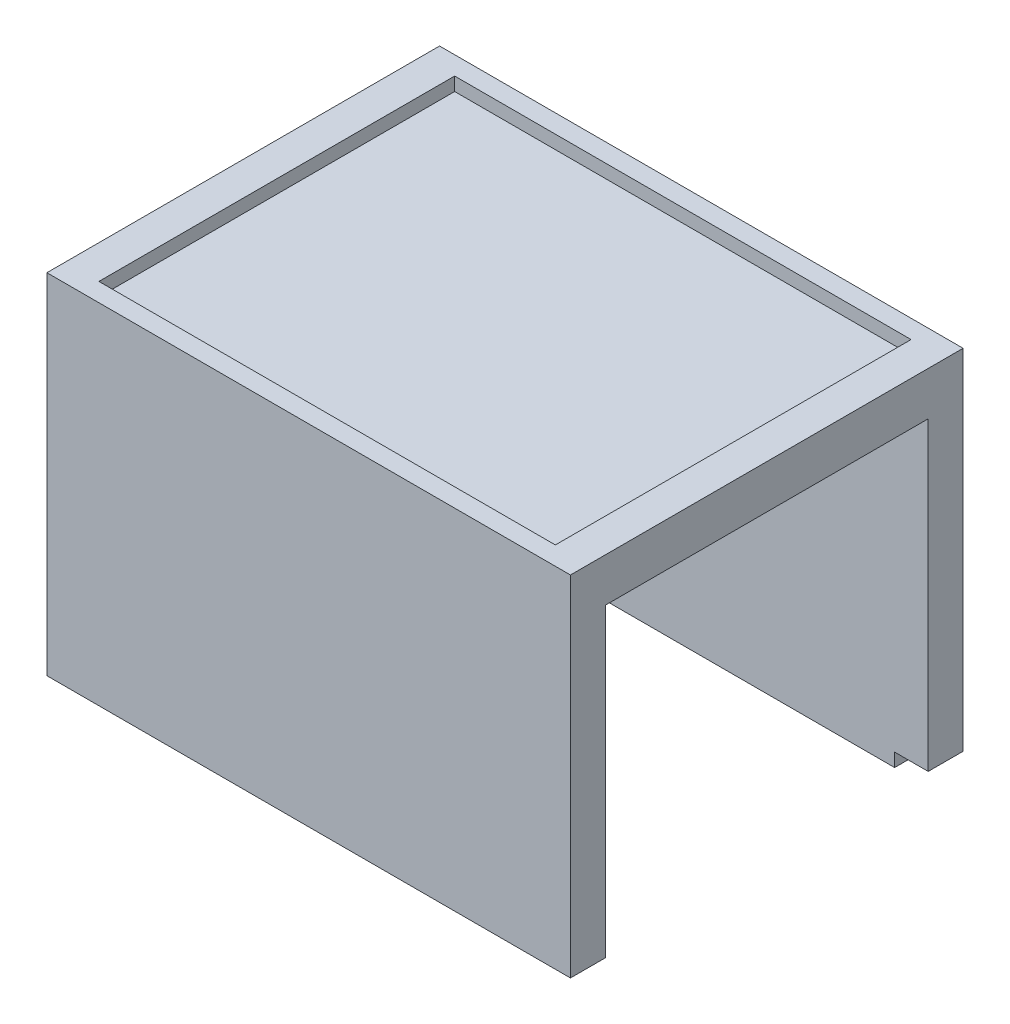
ISO-10303-21;
HEADER;
FILE_DESCRIPTION(('STEP AP214'),'2;1');
FILE_NAME('part.step','',(''),(''),'','','');
FILE_SCHEMA(('AUTOMOTIVE_DESIGN { 1 0 10303 214 1 1 1 1 }'));
ENDSEC;
DATA;
#1=APPLICATION_CONTEXT('core data for automotive mechanical design processes');
#2=APPLICATION_PROTOCOL_DEFINITION('international standard','automotive_design',2000,#1);
#3=PRODUCT_CONTEXT('',#1,'mechanical');
#4=PRODUCT('Part','Part','',(#3));
#5=PRODUCT_RELATED_PRODUCT_CATEGORY('part','',(#4));
#6=PRODUCT_DEFINITION_FORMATION('','',#4);
#7=PRODUCT_DEFINITION_CONTEXT('part definition',#1,'design');
#8=PRODUCT_DEFINITION('design','',#6,#7);
#9=PRODUCT_DEFINITION_SHAPE('','',#8);
#10=(LENGTH_UNIT() NAMED_UNIT(*) SI_UNIT(.MILLI.,.METRE.));
#11=(NAMED_UNIT(*) PLANE_ANGLE_UNIT() SI_UNIT($,.RADIAN.));
#12=(NAMED_UNIT(*) SI_UNIT($,.STERADIAN.) SOLID_ANGLE_UNIT());
#13=UNCERTAINTY_MEASURE_WITH_UNIT(LENGTH_MEASURE(1.E-05),#10,'distance_accuracy_value','');
#14=(GEOMETRIC_REPRESENTATION_CONTEXT(3) GLOBAL_UNCERTAINTY_ASSIGNED_CONTEXT((#13)) GLOBAL_UNIT_ASSIGNED_CONTEXT((#10,
#11,#12)) REPRESENTATION_CONTEXT('',''));
#15=CARTESIAN_POINT('',(0.,0.,0.));
#16=DIRECTION('',(0.,0.,1.));
#17=DIRECTION('',(1.,0.,0.));
#18=AXIS2_PLACEMENT_3D('',#15,#16,#17);
#19=CARTESIAN_POINT('',(0.,0.,0.));
#20=DIRECTION('',(0.,1.,0.));
#21=DIRECTION('',(0.,0.,1.));
#22=AXIS2_PLACEMENT_3D('',#19,#20,#21);
#23=PLANE('',#22);
#24=DIRECTION('',(-1.,0.,0.));
#25=VECTOR('',#24,1.);
#26=CARTESIAN_POINT('',(-19.5,0.,-12.025));
#27=LINE('',#26,#25);
#28=CARTESIAN_POINT('',(19.5,0.,-12.025));
#29=VERTEX_POINT('',#28);
#30=CARTESIAN_POINT('',(-19.5,0.,-12.025));
#31=VERTEX_POINT('',#30);
#32=EDGE_CURVE('E240',#29,#31,#27,.T.);
#33=ORIENTED_EDGE('',*,*,#32,.F.);
#34=DIRECTION('',(0.,0.,-1.));
#35=VECTOR('',#34,1.);
#36=CARTESIAN_POINT('',(19.5,0.,-14.625));
#37=LINE('',#36,#35);
#38=CARTESIAN_POINT('',(19.5,0.,12.025));
#39=VERTEX_POINT('',#38);
#40=EDGE_CURVE('E360',#39,#29,#37,.T.);
#41=ORIENTED_EDGE('',*,*,#40,.F.);
#42=DIRECTION('',(-1.,0.,0.));
#43=VECTOR('',#42,1.);
#44=CARTESIAN_POINT('',(-19.5,0.,12.025));
#45=LINE('',#44,#43);
#46=CARTESIAN_POINT('',(-19.5,0.,12.025));
#47=VERTEX_POINT('',#46);
#48=EDGE_CURVE('E297',#39,#47,#45,.T.);
#49=ORIENTED_EDGE('',*,*,#48,.T.);
#50=DIRECTION('',(0.,0.,1.));
#51=VECTOR('',#50,1.);
#52=CARTESIAN_POINT('',(-19.5,0.,-14.625));
#53=LINE('',#52,#51);
#54=EDGE_CURVE('E370',#31,#47,#53,.T.);
#55=ORIENTED_EDGE('',*,*,#54,.F.);
#56=EDGE_LOOP('',(#33,#41,#49,#55));
#57=FACE_BOUND('',#56,.T.);
#58=ADVANCED_FACE('F45',(#57),#23,.F.);
#59=CARTESIAN_POINT('',(0.,3.25,0.));
#60=DIRECTION('',(0.,1.,0.));
#61=DIRECTION('',(0.,0.,1.));
#62=AXIS2_PLACEMENT_3D('',#59,#60,#61);
#63=PLANE('',#62);
#64=DIRECTION('',(0.,0.,-1.));
#65=VECTOR('',#64,1.);
#66=CARTESIAN_POINT('',(19.5,3.25,-14.625));
#67=LINE('',#66,#65);
#68=CARTESIAN_POINT('',(19.5,3.25,14.625));
#69=VERTEX_POINT('',#68);
#70=CARTESIAN_POINT('',(19.5,3.25,-14.625));
#71=VERTEX_POINT('',#70);
#72=EDGE_CURVE('E365',#69,#71,#67,.T.);
#73=ORIENTED_EDGE('',*,*,#72,.T.);
#74=DIRECTION('',(-1.,0.,0.));
#75=VECTOR('',#74,1.);
#76=CARTESIAN_POINT('',(-19.5,3.25,-14.625));
#77=LINE('',#76,#75);
#78=CARTESIAN_POINT('',(-19.5,3.25,-14.625));
#79=VERTEX_POINT('',#78);
#80=EDGE_CURVE('E369',#71,#79,#77,.T.);
#81=ORIENTED_EDGE('',*,*,#80,.T.);
#82=DIRECTION('',(0.,0.,1.));
#83=VECTOR('',#82,1.);
#84=CARTESIAN_POINT('',(-19.5,3.25,-14.625));
#85=LINE('',#84,#83);
#86=CARTESIAN_POINT('',(-19.5,3.25,14.625));
#87=VERTEX_POINT('',#86);
#88=EDGE_CURVE('E373',#79,#87,#85,.T.);
#89=ORIENTED_EDGE('',*,*,#88,.T.);
#90=DIRECTION('',(1.,0.,0.));
#91=VECTOR('',#90,1.);
#92=CARTESIAN_POINT('',(-19.5,3.25,14.625));
#93=LINE('',#92,#91);
#94=EDGE_CURVE('E376',#87,#69,#93,.T.);
#95=ORIENTED_EDGE('',*,*,#94,.T.);
#96=EDGE_LOOP('',(#73,#81,#89,#95));
#97=FACE_BOUND('',#96,.T.);
#98=DIRECTION('',(1.,0.,0.));
#99=VECTOR('',#98,1.);
#100=CARTESIAN_POINT('',(-17.,3.25,-13.25));
#101=LINE('',#100,#99);
#102=CARTESIAN_POINT('',(-17.,3.25,-13.25));
#103=VERTEX_POINT('',#102);
#104=CARTESIAN_POINT('',(17.,3.25,-13.25));
#105=VERTEX_POINT('',#104);
#106=EDGE_CURVE('E317',#103,#105,#101,.T.);
#107=ORIENTED_EDGE('',*,*,#106,.T.);
#108=DIRECTION('',(0.,0.,-1.));
#109=VECTOR('',#108,1.);
#110=CARTESIAN_POINT('',(17.,3.25,-12.));
#111=LINE('',#110,#109);
#112=CARTESIAN_POINT('',(17.,3.25,13.25));
#113=VERTEX_POINT('',#112);
#114=EDGE_CURVE('E349',#113,#105,#111,.T.);
#115=ORIENTED_EDGE('',*,*,#114,.F.);
#116=DIRECTION('',(1.,0.,0.));
#117=VECTOR('',#116,1.);
#118=CARTESIAN_POINT('',(-17.,3.25,13.25));
#119=LINE('',#118,#117);
#120=CARTESIAN_POINT('',(-17.,3.25,13.25));
#121=VERTEX_POINT('',#120);
#122=EDGE_CURVE('E333',#121,#113,#119,.T.);
#123=ORIENTED_EDGE('',*,*,#122,.F.);
#124=DIRECTION('',(0.,0.,1.));
#125=VECTOR('',#124,1.);
#126=CARTESIAN_POINT('',(-17.,3.25,-12.));
#127=LINE('',#126,#125);
#128=EDGE_CURVE('E357',#103,#121,#127,.T.);
#129=ORIENTED_EDGE('',*,*,#128,.F.);
#130=EDGE_LOOP('',(#107,#115,#123,#129));
#131=FACE_BOUND('',#130,.T.);
#132=ADVANCED_FACE('F448',(#97,#131),#63,.T.);
#133=CARTESIAN_POINT('',(19.5,3.25,-14.625));
#134=DIRECTION('',(-1.,0.,0.));
#135=DIRECTION('',(0.,0.,1.));
#136=AXIS2_PLACEMENT_3D('',#133,#134,#135);
#137=PLANE('',#136);
#138=DIRECTION('',(0.,-1.,0.));
#139=VECTOR('',#138,1.);
#140=CARTESIAN_POINT('',(19.5,3.25,14.625));
#141=LINE('',#140,#139);
#142=CARTESIAN_POINT('',(19.5,-22.75,14.625));
#143=VERTEX_POINT('',#142);
#144=EDGE_CURVE('E379',#69,#143,#141,.T.);
#145=ORIENTED_EDGE('',*,*,#144,.T.);
#146=DIRECTION('',(0.,0.,1.));
#147=VECTOR('',#146,1.);
#148=CARTESIAN_POINT('',(19.5,-22.75,12.025));
#149=LINE('',#148,#147);
#150=CARTESIAN_POINT('',(19.5,-22.75,12.025));
#151=VERTEX_POINT('',#150);
#152=EDGE_CURVE('E313',#151,#143,#149,.T.);
#153=ORIENTED_EDGE('',*,*,#152,.F.);
#154=DIRECTION('',(0.,1.,0.));
#155=VECTOR('',#154,1.);
#156=CARTESIAN_POINT('',(19.5,0.,12.025));
#157=LINE('',#156,#155);
#158=EDGE_CURVE('E293',#151,#39,#157,.T.);
#159=ORIENTED_EDGE('',*,*,#158,.T.);
#160=ORIENTED_EDGE('',*,*,#40,.T.);
#161=DIRECTION('',(0.,1.,0.));
#162=VECTOR('',#161,1.);
#163=CARTESIAN_POINT('',(19.5,0.,-12.025));
#164=LINE('',#163,#162);
#165=CARTESIAN_POINT('',(19.5,-22.75,-12.025));
#166=VERTEX_POINT('',#165);
#167=EDGE_CURVE('E230',#166,#29,#164,.T.);
#168=ORIENTED_EDGE('',*,*,#167,.F.);
#169=DIRECTION('',(0.,0.,-1.));
#170=VECTOR('',#169,1.);
#171=CARTESIAN_POINT('',(19.5,-22.75,-12.025));
#172=LINE('',#171,#170);
#173=CARTESIAN_POINT('',(19.5,-22.75,-14.625));
#174=VERTEX_POINT('',#173);
#175=EDGE_CURVE('E243',#166,#174,#172,.T.);
#176=ORIENTED_EDGE('',*,*,#175,.T.);
#177=DIRECTION('',(0.,-1.,0.));
#178=VECTOR('',#177,1.);
#179=CARTESIAN_POINT('',(19.5,3.25,-14.625));
#180=LINE('',#179,#178);
#181=EDGE_CURVE('E11',#71,#174,#180,.T.);
#182=ORIENTED_EDGE('',*,*,#181,.F.);
#183=ORIENTED_EDGE('',*,*,#72,.F.);
#184=EDGE_LOOP('',(#145,#153,#159,#160,#168,#176,#182,#183));
#185=FACE_BOUND('',#184,.T.);
#186=ADVANCED_FACE('F47',(#185),#137,.F.);
#187=CARTESIAN_POINT('',(-19.5,3.25,-14.625));
#188=DIRECTION('',(0.,0.,1.));
#189=DIRECTION('',(1.,0.,0.));
#190=AXIS2_PLACEMENT_3D('',#187,#188,#189);
#191=PLANE('',#190);
#192=ORIENTED_EDGE('',*,*,#181,.T.);
#193=DIRECTION('',(1.,0.,0.));
#194=VECTOR('',#193,1.);
#195=CARTESIAN_POINT('',(-19.5,-22.75,-14.625));
#196=LINE('',#195,#194);
#197=CARTESIAN_POINT('',(-19.5,-22.75,-14.625));
#198=VERTEX_POINT('',#197);
#199=EDGE_CURVE('E189',#198,#174,#196,.T.);
#200=ORIENTED_EDGE('',*,*,#199,.F.);
#201=DIRECTION('',(0.,-1.,0.));
#202=VECTOR('',#201,1.);
#203=CARTESIAN_POINT('',(-19.5,3.25,-14.625));
#204=LINE('',#203,#202);
#205=EDGE_CURVE('E54',#79,#198,#204,.T.);
#206=ORIENTED_EDGE('',*,*,#205,.F.);
#207=ORIENTED_EDGE('',*,*,#80,.F.);
#208=EDGE_LOOP('',(#192,#200,#206,#207));
#209=FACE_BOUND('',#208,.T.);
#210=ADVANCED_FACE('F403',(#209),#191,.F.);
#211=CARTESIAN_POINT('',(-19.5,3.25,-14.625));
#212=DIRECTION('',(1.,0.,0.));
#213=DIRECTION('',(0.,0.,-1.));
#214=AXIS2_PLACEMENT_3D('',#211,#212,#213);
#215=PLANE('',#214);
#216=ORIENTED_EDGE('',*,*,#205,.T.);
#217=DIRECTION('',(0.,0.,-1.));
#218=VECTOR('',#217,1.);
#219=CARTESIAN_POINT('',(-19.5,-22.75,-12.025));
#220=LINE('',#219,#218);
#221=CARTESIAN_POINT('',(-19.5,-22.75,-12.025));
#222=VERTEX_POINT('',#221);
#223=EDGE_CURVE('E247',#222,#198,#220,.T.);
#224=ORIENTED_EDGE('',*,*,#223,.F.);
#225=DIRECTION('',(0.,-1.,0.));
#226=VECTOR('',#225,1.);
#227=CARTESIAN_POINT('',(-19.5,0.,-12.025));
#228=LINE('',#227,#226);
#229=EDGE_CURVE('E237',#31,#222,#228,.T.);
#230=ORIENTED_EDGE('',*,*,#229,.F.);
#231=ORIENTED_EDGE('',*,*,#54,.T.);
#232=DIRECTION('',(0.,-1.,0.));
#233=VECTOR('',#232,1.);
#234=CARTESIAN_POINT('',(-19.5,0.,12.025));
#235=LINE('',#234,#233);
#236=CARTESIAN_POINT('',(-19.5,-22.75,12.025));
#237=VERTEX_POINT('',#236);
#238=EDGE_CURVE('E301',#47,#237,#235,.T.);
#239=ORIENTED_EDGE('',*,*,#238,.T.);
#240=DIRECTION('',(0.,0.,1.));
#241=VECTOR('',#240,1.);
#242=CARTESIAN_POINT('',(-19.5,-22.75,12.025));
#243=LINE('',#242,#241);
#244=CARTESIAN_POINT('',(-19.5,-22.75,14.625));
#245=VERTEX_POINT('',#244);
#246=EDGE_CURVE('E309',#237,#245,#243,.T.);
#247=ORIENTED_EDGE('',*,*,#246,.T.);
#248=DIRECTION('',(0.,-1.,0.));
#249=VECTOR('',#248,1.);
#250=CARTESIAN_POINT('',(-19.5,3.25,14.625));
#251=LINE('',#250,#249);
#252=EDGE_CURVE('E387',#87,#245,#251,.T.);
#253=ORIENTED_EDGE('',*,*,#252,.F.);
#254=ORIENTED_EDGE('',*,*,#88,.F.);
#255=EDGE_LOOP('',(#216,#224,#230,#231,#239,#247,#253,#254));
#256=FACE_BOUND('',#255,.T.);
#257=ADVANCED_FACE('F394',(#256),#215,.F.);
#258=CARTESIAN_POINT('',(-19.5,3.25,14.625));
#259=DIRECTION('',(0.,0.,-1.));
#260=DIRECTION('',(-1.,0.,0.));
#261=AXIS2_PLACEMENT_3D('',#258,#259,#260);
#262=PLANE('',#261);
#263=ORIENTED_EDGE('',*,*,#252,.T.);
#264=DIRECTION('',(1.,0.,0.));
#265=VECTOR('',#264,1.);
#266=CARTESIAN_POINT('',(-19.5,-22.75,14.625));
#267=LINE('',#266,#265);
#268=EDGE_CURVE('E292',#245,#143,#267,.T.);
#269=ORIENTED_EDGE('',*,*,#268,.T.);
#270=ORIENTED_EDGE('',*,*,#144,.F.);
#271=ORIENTED_EDGE('',*,*,#94,.F.);
#272=EDGE_LOOP('',(#263,#269,#270,#271));
#273=FACE_BOUND('',#272,.T.);
#274=ADVANCED_FACE('F458',(#273),#262,.F.);
#275=CARTESIAN_POINT('',(17.,2.25,-12.));
#276=DIRECTION('',(1.,0.,0.));
#277=DIRECTION('',(0.,0.,-1.));
#278=AXIS2_PLACEMENT_3D('',#275,#276,#277);
#279=PLANE('',#278);
#280=ORIENTED_EDGE('',*,*,#114,.T.);
#281=DIRECTION('',(0.,1.,0.));
#282=VECTOR('',#281,1.);
#283=CARTESIAN_POINT('',(17.,2.25,-13.25));
#284=LINE('',#283,#282);
#285=CARTESIAN_POINT('',(17.,2.25,-13.25));
#286=VERTEX_POINT('',#285);
#287=EDGE_CURVE('E325',#286,#105,#284,.T.);
#288=ORIENTED_EDGE('',*,*,#287,.F.);
#289=DIRECTION('',(0.,0.,-1.));
#290=VECTOR('',#289,1.);
#291=CARTESIAN_POINT('',(17.,2.25,-12.));
#292=LINE('',#291,#290);
#293=CARTESIAN_POINT('',(17.,2.25,13.25));
#294=VERTEX_POINT('',#293);
#295=EDGE_CURVE('E353',#294,#286,#292,.T.);
#296=ORIENTED_EDGE('',*,*,#295,.F.);
#297=DIRECTION('',(0.,1.,0.));
#298=VECTOR('',#297,1.);
#299=CARTESIAN_POINT('',(17.,2.25,13.25));
#300=LINE('',#299,#298);
#301=EDGE_CURVE('E345',#294,#113,#300,.T.);
#302=ORIENTED_EDGE('',*,*,#301,.T.);
#303=EDGE_LOOP('',(#280,#288,#296,#302));
#304=FACE_BOUND('',#303,.T.);
#305=ADVANCED_FACE('F461',(#304),#279,.F.);
#306=CARTESIAN_POINT('',(-17.,2.25,-12.));
#307=DIRECTION('',(-1.,0.,0.));
#308=DIRECTION('',(0.,0.,1.));
#309=AXIS2_PLACEMENT_3D('',#306,#307,#308);
#310=PLANE('',#309);
#311=ORIENTED_EDGE('',*,*,#128,.T.);
#312=DIRECTION('',(0.,1.,0.));
#313=VECTOR('',#312,1.);
#314=CARTESIAN_POINT('',(-17.,2.25,13.25));
#315=LINE('',#314,#313);
#316=CARTESIAN_POINT('',(-17.,2.25,13.25));
#317=VERTEX_POINT('',#316);
#318=EDGE_CURVE('E341',#317,#121,#315,.T.);
#319=ORIENTED_EDGE('',*,*,#318,.F.);
#320=DIRECTION('',(0.,0.,1.));
#321=VECTOR('',#320,1.);
#322=CARTESIAN_POINT('',(-17.,2.25,-12.));
#323=LINE('',#322,#321);
#324=CARTESIAN_POINT('',(-17.,2.25,-13.25));
#325=VERTEX_POINT('',#324);
#326=EDGE_CURVE('E356',#325,#317,#323,.T.);
#327=ORIENTED_EDGE('',*,*,#326,.F.);
#328=DIRECTION('',(0.,1.,0.));
#329=VECTOR('',#328,1.);
#330=CARTESIAN_POINT('',(-17.,2.25,-13.25));
#331=LINE('',#330,#329);
#332=EDGE_CURVE('E329',#325,#103,#331,.T.);
#333=ORIENTED_EDGE('',*,*,#332,.T.);
#334=EDGE_LOOP('',(#311,#319,#327,#333));
#335=FACE_BOUND('',#334,.T.);
#336=ADVANCED_FACE('F621',(#335),#310,.F.);
#337=CARTESIAN_POINT('',(0.,2.25,0.));
#338=DIRECTION('',(0.,1.,0.));
#339=DIRECTION('',(0.,0.,1.));
#340=AXIS2_PLACEMENT_3D('',#337,#338,#339);
#341=PLANE('',#340);
#342=ORIENTED_EDGE('',*,*,#295,.T.);
#343=DIRECTION('',(1.,0.,0.));
#344=VECTOR('',#343,1.);
#345=CARTESIAN_POINT('',(-17.,2.25,-13.25));
#346=LINE('',#345,#344);
#347=EDGE_CURVE('E321',#325,#286,#346,.T.);
#348=ORIENTED_EDGE('',*,*,#347,.F.);
#349=ORIENTED_EDGE('',*,*,#326,.T.);
#350=DIRECTION('',(1.,0.,0.));
#351=VECTOR('',#350,1.);
#352=CARTESIAN_POINT('',(-17.,2.25,13.25));
#353=LINE('',#352,#351);
#354=EDGE_CURVE('E337',#317,#294,#353,.T.);
#355=ORIENTED_EDGE('',*,*,#354,.T.);
#356=EDGE_LOOP('',(#342,#348,#349,#355));
#357=FACE_BOUND('',#356,.T.);
#358=ADVANCED_FACE('F611',(#357),#341,.T.);
#359=CARTESIAN_POINT('',(-17.,2.25,13.25));
#360=DIRECTION('',(0.,0.,1.));
#361=DIRECTION('',(1.,0.,0.));
#362=AXIS2_PLACEMENT_3D('',#359,#360,#361);
#363=PLANE('',#362);
#364=ORIENTED_EDGE('',*,*,#122,.T.);
#365=ORIENTED_EDGE('',*,*,#301,.F.);
#366=ORIENTED_EDGE('',*,*,#354,.F.);
#367=ORIENTED_EDGE('',*,*,#318,.T.);
#368=EDGE_LOOP('',(#364,#365,#366,#367));
#369=FACE_BOUND('',#368,.T.);
#370=ADVANCED_FACE('F593',(#369),#363,.F.);
#371=CARTESIAN_POINT('',(-17.,2.25,-13.25));
#372=DIRECTION('',(0.,0.,1.));
#373=DIRECTION('',(1.,0.,0.));
#374=AXIS2_PLACEMENT_3D('',#371,#372,#373);
#375=PLANE('',#374);
#376=ORIENTED_EDGE('',*,*,#106,.F.);
#377=ORIENTED_EDGE('',*,*,#332,.F.);
#378=ORIENTED_EDGE('',*,*,#347,.T.);
#379=ORIENTED_EDGE('',*,*,#287,.T.);
#380=EDGE_LOOP('',(#376,#377,#378,#379));
#381=FACE_BOUND('',#380,.T.);
#382=ADVANCED_FACE('F586',(#381),#375,.T.);
#383=CARTESIAN_POINT('',(-19.5,-22.75,12.025));
#384=DIRECTION('',(0.,-1.,0.));
#385=DIRECTION('',(0.,0.,-1.));
#386=AXIS2_PLACEMENT_3D('',#383,#384,#385);
#387=PLANE('',#386);
#388=DIRECTION('',(0.,0.,1.));
#389=VECTOR('',#388,1.);
#390=CARTESIAN_POINT('',(17.,-22.75,13.275));
#391=LINE('',#390,#389);
#392=CARTESIAN_POINT('',(17.,-22.75,12.025));
#393=VERTEX_POINT('',#392);
#394=CARTESIAN_POINT('',(17.,-22.75,13.275));
#395=VERTEX_POINT('',#394);
#396=EDGE_CURVE('E251',#393,#395,#391,.T.);
#397=ORIENTED_EDGE('',*,*,#396,.F.);
#398=DIRECTION('',(1.,0.,0.));
#399=VECTOR('',#398,1.);
#400=CARTESIAN_POINT('',(-19.5,-22.75,12.025));
#401=LINE('',#400,#399);
#402=EDGE_CURVE('E305',#393,#151,#401,.T.);
#403=ORIENTED_EDGE('',*,*,#402,.T.);
#404=ORIENTED_EDGE('',*,*,#152,.T.);
#405=ORIENTED_EDGE('',*,*,#268,.F.);
#406=ORIENTED_EDGE('',*,*,#246,.F.);
#407=CARTESIAN_POINT('',(-17.,-22.75,12.025));
#408=VERTEX_POINT('',#407);
#409=EDGE_CURVE('E306',#237,#408,#401,.T.);
#410=ORIENTED_EDGE('',*,*,#409,.T.);
#411=DIRECTION('',(0.,0.,-1.));
#412=VECTOR('',#411,1.);
#413=CARTESIAN_POINT('',(-17.,-22.75,13.275));
#414=LINE('',#413,#412);
#415=CARTESIAN_POINT('',(-17.,-22.75,13.275));
#416=VERTEX_POINT('',#415);
#417=EDGE_CURVE('E260',#416,#408,#414,.T.);
#418=ORIENTED_EDGE('',*,*,#417,.F.);
#419=DIRECTION('',(-1.,0.,0.));
#420=VECTOR('',#419,1.);
#421=CARTESIAN_POINT('',(-17.,-22.75,13.275));
#422=LINE('',#421,#420);
#423=EDGE_CURVE('E69',#395,#416,#422,.T.);
#424=ORIENTED_EDGE('',*,*,#423,.F.);
#425=EDGE_LOOP('',(#397,#403,#404,#405,#406,#410,#418,#424));
#426=FACE_BOUND('',#425,.T.);
#427=ADVANCED_FACE('F412',(#426),#387,.T.);
#428=CARTESIAN_POINT('',(0.,0.,12.025));
#429=DIRECTION('',(0.,0.,1.));
#430=DIRECTION('',(1.,0.,0.));
#431=AXIS2_PLACEMENT_3D('',#428,#429,#430);
#432=PLANE('',#431);
#433=ORIENTED_EDGE('',*,*,#158,.F.);
#434=ORIENTED_EDGE('',*,*,#402,.F.);
#435=DIRECTION('',(0.,1.,0.));
#436=VECTOR('',#435,1.);
#437=CARTESIAN_POINT('',(17.,-23.75,12.025));
#438=LINE('',#437,#436);
#439=CARTESIAN_POINT('',(17.,-23.75,12.025));
#440=VERTEX_POINT('',#439);
#441=EDGE_CURVE('E269',#440,#393,#438,.T.);
#442=ORIENTED_EDGE('',*,*,#441,.F.);
#443=DIRECTION('',(1.,0.,0.));
#444=VECTOR('',#443,1.);
#445=CARTESIAN_POINT('',(-17.,-23.75,12.025));
#446=LINE('',#445,#444);
#447=CARTESIAN_POINT('',(-17.,-23.75,12.025));
#448=VERTEX_POINT('',#447);
#449=EDGE_CURVE('E266',#448,#440,#446,.T.);
#450=ORIENTED_EDGE('',*,*,#449,.F.);
#451=DIRECTION('',(0.,1.,0.));
#452=VECTOR('',#451,1.);
#453=CARTESIAN_POINT('',(-17.,-23.75,12.025));
#454=LINE('',#453,#452);
#455=EDGE_CURVE('E281',#448,#408,#454,.T.);
#456=ORIENTED_EDGE('',*,*,#455,.T.);
#457=ORIENTED_EDGE('',*,*,#409,.F.);
#458=ORIENTED_EDGE('',*,*,#238,.F.);
#459=ORIENTED_EDGE('',*,*,#48,.F.);
#460=EDGE_LOOP('',(#433,#434,#442,#450,#456,#457,#458,#459));
#461=FACE_BOUND('',#460,.T.);
#462=ADVANCED_FACE('F419',(#461),#432,.F.);
#463=CARTESIAN_POINT('',(17.,-23.75,13.275));
#464=DIRECTION('',(-1.,0.,0.));
#465=DIRECTION('',(0.,0.,1.));
#466=AXIS2_PLACEMENT_3D('',#463,#464,#465);
#467=PLANE('',#466);
#468=ORIENTED_EDGE('',*,*,#396,.T.);
#469=DIRECTION('',(0.,1.,0.));
#470=VECTOR('',#469,1.);
#471=CARTESIAN_POINT('',(17.,-23.75,13.275));
#472=LINE('',#471,#470);
#473=CARTESIAN_POINT('',(17.,-23.75,13.275));
#474=VERTEX_POINT('',#473);
#475=EDGE_CURVE('E289',#474,#395,#472,.T.);
#476=ORIENTED_EDGE('',*,*,#475,.F.);
#477=DIRECTION('',(0.,0.,1.));
#478=VECTOR('',#477,1.);
#479=CARTESIAN_POINT('',(17.,-23.75,13.275));
#480=LINE('',#479,#478);
#481=EDGE_CURVE('E255',#440,#474,#480,.T.);
#482=ORIENTED_EDGE('',*,*,#481,.F.);
#483=ORIENTED_EDGE('',*,*,#441,.T.);
#484=EDGE_LOOP('',(#468,#476,#482,#483));
#485=FACE_BOUND('',#484,.T.);
#486=ADVANCED_FACE('F436',(#485),#467,.F.);
#487=CARTESIAN_POINT('',(-17.,-23.75,13.275));
#488=DIRECTION('',(0.,0.,-1.));
#489=DIRECTION('',(-1.,0.,0.));
#490=AXIS2_PLACEMENT_3D('',#487,#488,#489);
#491=PLANE('',#490);
#492=ORIENTED_EDGE('',*,*,#423,.T.);
#493=DIRECTION('',(0.,1.,0.));
#494=VECTOR('',#493,1.);
#495=CARTESIAN_POINT('',(-17.,-23.75,13.275));
#496=LINE('',#495,#494);
#497=CARTESIAN_POINT('',(-17.,-23.75,13.275));
#498=VERTEX_POINT('',#497);
#499=EDGE_CURVE('E285',#498,#416,#496,.T.);
#500=ORIENTED_EDGE('',*,*,#499,.F.);
#501=DIRECTION('',(-1.,0.,0.));
#502=VECTOR('',#501,1.);
#503=CARTESIAN_POINT('',(-17.,-23.75,13.275));
#504=LINE('',#503,#502);
#505=EDGE_CURVE('E259',#474,#498,#504,.T.);
#506=ORIENTED_EDGE('',*,*,#505,.F.);
#507=ORIENTED_EDGE('',*,*,#475,.T.);
#508=EDGE_LOOP('',(#492,#500,#506,#507));
#509=FACE_BOUND('',#508,.T.);
#510=ADVANCED_FACE('F432',(#509),#491,.F.);
#511=CARTESIAN_POINT('',(-17.,-23.75,13.275));
#512=DIRECTION('',(1.,0.,0.));
#513=DIRECTION('',(0.,0.,-1.));
#514=AXIS2_PLACEMENT_3D('',#511,#512,#513);
#515=PLANE('',#514);
#516=ORIENTED_EDGE('',*,*,#417,.T.);
#517=ORIENTED_EDGE('',*,*,#455,.F.);
#518=DIRECTION('',(0.,0.,-1.));
#519=VECTOR('',#518,1.);
#520=CARTESIAN_POINT('',(-17.,-23.75,13.275));
#521=LINE('',#520,#519);
#522=EDGE_CURVE('E263',#498,#448,#521,.T.);
#523=ORIENTED_EDGE('',*,*,#522,.F.);
#524=ORIENTED_EDGE('',*,*,#499,.T.);
#525=EDGE_LOOP('',(#516,#517,#523,#524));
#526=FACE_BOUND('',#525,.T.);
#527=ADVANCED_FACE('F428',(#526),#515,.F.);
#528=CARTESIAN_POINT('',(0.,-23.75,0.));
#529=DIRECTION('',(0.,-1.,0.));
#530=DIRECTION('',(0.,0.,-1.));
#531=AXIS2_PLACEMENT_3D('',#528,#529,#530);
#532=PLANE('',#531);
#533=ORIENTED_EDGE('',*,*,#481,.T.);
#534=ORIENTED_EDGE('',*,*,#505,.T.);
#535=ORIENTED_EDGE('',*,*,#522,.T.);
#536=ORIENTED_EDGE('',*,*,#449,.T.);
#537=EDGE_LOOP('',(#533,#534,#535,#536));
#538=FACE_BOUND('',#537,.T.);
#539=ADVANCED_FACE('F438',(#538),#532,.T.);
#540=CARTESIAN_POINT('',(-19.5,-22.75,-12.025));
#541=DIRECTION('',(0.,1.,0.));
#542=DIRECTION('',(0.,0.,1.));
#543=AXIS2_PLACEMENT_3D('',#540,#541,#542);
#544=PLANE('',#543);
#545=DIRECTION('',(1.,0.,0.));
#546=VECTOR('',#545,1.);
#547=CARTESIAN_POINT('',(-19.5,-22.75,-12.025));
#548=LINE('',#547,#546);
#549=CARTESIAN_POINT('',(17.,-22.75,-12.025));
#550=VERTEX_POINT('',#549);
#551=EDGE_CURVE('E233',#550,#166,#548,.T.);
#552=ORIENTED_EDGE('',*,*,#551,.F.);
#553=DIRECTION('',(0.,0.,-1.));
#554=VECTOR('',#553,1.);
#555=CARTESIAN_POINT('',(17.,-22.75,-13.275));
#556=LINE('',#555,#554);
#557=CARTESIAN_POINT('',(17.,-22.75,-13.275));
#558=VERTEX_POINT('',#557);
#559=EDGE_CURVE('E61',#550,#558,#556,.T.);
#560=ORIENTED_EDGE('',*,*,#559,.T.);
#561=DIRECTION('',(-1.,0.,0.));
#562=VECTOR('',#561,1.);
#563=CARTESIAN_POINT('',(-17.,-22.75,-13.275));
#564=LINE('',#563,#562);
#565=CARTESIAN_POINT('',(-17.,-22.75,-13.275));
#566=VERTEX_POINT('',#565);
#567=EDGE_CURVE('E201',#558,#566,#564,.T.);
#568=ORIENTED_EDGE('',*,*,#567,.T.);
#569=DIRECTION('',(0.,0.,1.));
#570=VECTOR('',#569,1.);
#571=CARTESIAN_POINT('',(-17.,-22.75,-13.275));
#572=LINE('',#571,#570);
#573=CARTESIAN_POINT('',(-17.,-22.75,-12.025));
#574=VERTEX_POINT('',#573);
#575=EDGE_CURVE('E216',#566,#574,#572,.T.);
#576=ORIENTED_EDGE('',*,*,#575,.T.);
#577=EDGE_CURVE('E234',#222,#574,#548,.T.);
#578=ORIENTED_EDGE('',*,*,#577,.F.);
#579=ORIENTED_EDGE('',*,*,#223,.T.);
#580=ORIENTED_EDGE('',*,*,#199,.T.);
#581=ORIENTED_EDGE('',*,*,#175,.F.);
#582=EDGE_LOOP('',(#552,#560,#568,#576,#578,#579,#580,#581));
#583=FACE_BOUND('',#582,.T.);
#584=ADVANCED_FACE('F401',(#583),#544,.F.);
#585=CARTESIAN_POINT('',(0.,0.,-12.025));
#586=DIRECTION('',(0.,0.,-1.));
#587=DIRECTION('',(1.,0.,0.));
#588=AXIS2_PLACEMENT_3D('',#585,#586,#587);
#589=PLANE('',#588);
#590=ORIENTED_EDGE('',*,*,#167,.T.);
#591=ORIENTED_EDGE('',*,*,#32,.T.);
#592=ORIENTED_EDGE('',*,*,#229,.T.);
#593=ORIENTED_EDGE('',*,*,#577,.T.);
#594=DIRECTION('',(0.,1.,0.));
#595=VECTOR('',#594,1.);
#596=CARTESIAN_POINT('',(-17.,-23.75,-12.025));
#597=LINE('',#596,#595);
#598=CARTESIAN_POINT('',(-17.,-23.75,-12.025));
#599=VERTEX_POINT('',#598);
#600=EDGE_CURVE('E190',#599,#574,#597,.T.);
#601=ORIENTED_EDGE('',*,*,#600,.F.);
#602=DIRECTION('',(1.,0.,0.));
#603=VECTOR('',#602,1.);
#604=CARTESIAN_POINT('',(-17.,-23.75,-12.025));
#605=LINE('',#604,#603);
#606=CARTESIAN_POINT('',(17.,-23.75,-12.025));
#607=VERTEX_POINT('',#606);
#608=EDGE_CURVE('E196',#599,#607,#605,.T.);
#609=ORIENTED_EDGE('',*,*,#608,.T.);
#610=DIRECTION('',(0.,1.,0.));
#611=VECTOR('',#610,1.);
#612=CARTESIAN_POINT('',(17.,-23.75,-12.025));
#613=LINE('',#612,#611);
#614=EDGE_CURVE('E180',#607,#550,#613,.T.);
#615=ORIENTED_EDGE('',*,*,#614,.T.);
#616=ORIENTED_EDGE('',*,*,#551,.T.);
#617=EDGE_LOOP('',(#590,#591,#592,#593,#601,#609,#615,#616));
#618=FACE_BOUND('',#617,.T.);
#619=ADVANCED_FACE('F203',(#618),#589,.F.);
#620=CARTESIAN_POINT('',(17.,-23.75,-13.275));
#621=DIRECTION('',(1.,0.,0.));
#622=DIRECTION('',(0.,0.,-1.));
#623=AXIS2_PLACEMENT_3D('',#620,#621,#622);
#624=PLANE('',#623);
#625=ORIENTED_EDGE('',*,*,#559,.F.);
#626=ORIENTED_EDGE('',*,*,#614,.F.);
#627=DIRECTION('',(0.,0.,-1.));
#628=VECTOR('',#627,1.);
#629=CARTESIAN_POINT('',(17.,-23.75,-13.275));
#630=LINE('',#629,#628);
#631=CARTESIAN_POINT('',(17.,-23.75,-13.275));
#632=VERTEX_POINT('',#631);
#633=EDGE_CURVE('E183',#607,#632,#630,.T.);
#634=ORIENTED_EDGE('',*,*,#633,.T.);
#635=DIRECTION('',(0.,1.,0.));
#636=VECTOR('',#635,1.);
#637=CARTESIAN_POINT('',(17.,-23.75,-13.275));
#638=LINE('',#637,#636);
#639=EDGE_CURVE('E213',#632,#558,#638,.T.);
#640=ORIENTED_EDGE('',*,*,#639,.T.);
#641=EDGE_LOOP('',(#625,#626,#634,#640));
#642=FACE_BOUND('',#641,.T.);
#643=ADVANCED_FACE('F182',(#642),#624,.T.);
#644=CARTESIAN_POINT('',(-17.,-23.75,-13.275));
#645=DIRECTION('',(-1.,0.,0.));
#646=DIRECTION('',(0.,0.,1.));
#647=AXIS2_PLACEMENT_3D('',#644,#645,#646);
#648=PLANE('',#647);
#649=ORIENTED_EDGE('',*,*,#575,.F.);
#650=DIRECTION('',(0.,1.,0.));
#651=VECTOR('',#650,1.);
#652=CARTESIAN_POINT('',(-17.,-23.75,-13.275));
#653=LINE('',#652,#651);
#654=CARTESIAN_POINT('',(-17.,-23.75,-13.275));
#655=VERTEX_POINT('',#654);
#656=EDGE_CURVE('E225',#655,#566,#653,.T.);
#657=ORIENTED_EDGE('',*,*,#656,.F.);
#658=DIRECTION('',(0.,0.,1.));
#659=VECTOR('',#658,1.);
#660=CARTESIAN_POINT('',(-17.,-23.75,-13.275));
#661=LINE('',#660,#659);
#662=EDGE_CURVE('E206',#655,#599,#661,.T.);
#663=ORIENTED_EDGE('',*,*,#662,.T.);
#664=ORIENTED_EDGE('',*,*,#600,.T.);
#665=EDGE_LOOP('',(#649,#657,#663,#664));
#666=FACE_BOUND('',#665,.T.);
#667=ADVANCED_FACE('F517',(#666),#648,.T.);
#668=CARTESIAN_POINT('',(-17.,-23.75,-13.275));
#669=DIRECTION('',(0.,0.,-1.));
#670=DIRECTION('',(-1.,0.,0.));
#671=AXIS2_PLACEMENT_3D('',#668,#669,#670);
#672=PLANE('',#671);
#673=ORIENTED_EDGE('',*,*,#567,.F.);
#674=ORIENTED_EDGE('',*,*,#639,.F.);
#675=DIRECTION('',(-1.,0.,0.));
#676=VECTOR('',#675,1.);
#677=CARTESIAN_POINT('',(-17.,-23.75,-13.275));
#678=LINE('',#677,#676);
#679=EDGE_CURVE('E199',#632,#655,#678,.T.);
#680=ORIENTED_EDGE('',*,*,#679,.T.);
#681=ORIENTED_EDGE('',*,*,#656,.T.);
#682=EDGE_LOOP('',(#673,#674,#680,#681));
#683=FACE_BOUND('',#682,.T.);
#684=ADVANCED_FACE('F526',(#683),#672,.T.);
#685=CARTESIAN_POINT('',(0.,-23.75,0.));
#686=DIRECTION('',(0.,-1.,0.));
#687=DIRECTION('',(0.,0.,1.));
#688=AXIS2_PLACEMENT_3D('',#685,#686,#687);
#689=PLANE('',#688);
#690=ORIENTED_EDGE('',*,*,#633,.F.);
#691=ORIENTED_EDGE('',*,*,#608,.F.);
#692=ORIENTED_EDGE('',*,*,#662,.F.);
#693=ORIENTED_EDGE('',*,*,#679,.F.);
#694=EDGE_LOOP('',(#690,#691,#692,#693));
#695=FACE_BOUND('',#694,.T.);
#696=ADVANCED_FACE('F194',(#695),#689,.T.);
#697=CLOSED_SHELL('',(#58,#132,#186,#210,#257,#274,#305,#336,#358,#370,#382,#427,#462,#486,#510,
#527,#539,#584,#619,#643,#667,#684,#696));
#698=MANIFOLD_SOLID_BREP('B2',#697);
#699=ADVANCED_BREP_SHAPE_REPRESENTATION('',(#18,#698),#14);
#700=SHAPE_DEFINITION_REPRESENTATION(#9,#699);
ENDSEC;
END-ISO-10303-21;
